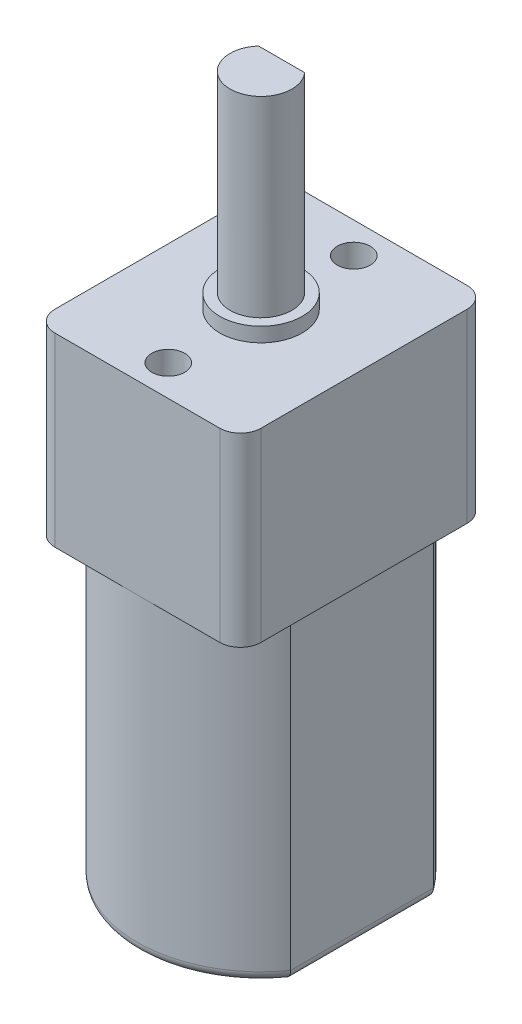
ISO-10303-21;
HEADER;
FILE_DESCRIPTION(('STEP AP214'),'2;1');
FILE_NAME('part.step','',(''),(''),'','','');
FILE_SCHEMA(('AUTOMOTIVE_DESIGN { 1 0 10303 214 1 1 1 1 }'));
ENDSEC;
DATA;
#1=APPLICATION_CONTEXT('core data for automotive mechanical design processes');
#2=APPLICATION_PROTOCOL_DEFINITION('international standard','automotive_design',2000,#1);
#3=PRODUCT_CONTEXT('',#1,'mechanical');
#4=PRODUCT('Part','Part','',(#3));
#5=PRODUCT_RELATED_PRODUCT_CATEGORY('part','',(#4));
#6=PRODUCT_DEFINITION_FORMATION('','',#4);
#7=PRODUCT_DEFINITION_CONTEXT('part definition',#1,'design');
#8=PRODUCT_DEFINITION('design','',#6,#7);
#9=PRODUCT_DEFINITION_SHAPE('','',#8);
#10=(LENGTH_UNIT() NAMED_UNIT(*) SI_UNIT(.MILLI.,.METRE.));
#11=(NAMED_UNIT(*) PLANE_ANGLE_UNIT() SI_UNIT($,.RADIAN.));
#12=(NAMED_UNIT(*) SI_UNIT($,.STERADIAN.) SOLID_ANGLE_UNIT());
#13=UNCERTAINTY_MEASURE_WITH_UNIT(LENGTH_MEASURE(1.E-05),#10,'distance_accuracy_value','');
#14=(GEOMETRIC_REPRESENTATION_CONTEXT(3) GLOBAL_UNCERTAINTY_ASSIGNED_CONTEXT((#13)) GLOBAL_UNIT_ASSIGNED_CONTEXT((#10,
#11,#12)) REPRESENTATION_CONTEXT('',''));
#15=CARTESIAN_POINT('',(0.,0.,0.));
#16=DIRECTION('',(0.,0.,1.));
#17=DIRECTION('',(1.,0.,0.));
#18=AXIS2_PLACEMENT_3D('',#15,#16,#17);
#19=CARTESIAN_POINT('',(0.,0.,0.));
#20=DIRECTION('',(0.,1.,0.));
#21=DIRECTION('',(0.,0.,1.));
#22=AXIS2_PLACEMENT_3D('',#19,#20,#21);
#23=PLANE('',#22);
#24=DIRECTION('',(0.,0.,1.));
#25=VECTOR('',#24,1.);
#26=CARTESIAN_POINT('',(5.,0.,0.));
#27=LINE('',#26,#25);
#28=CARTESIAN_POINT('',(5.,0.,-5.));
#29=VERTEX_POINT('',#28);
#30=CARTESIAN_POINT('',(5.,0.,5.));
#31=VERTEX_POINT('',#30);
#32=EDGE_CURVE('E256',#29,#31,#27,.T.);
#33=ORIENTED_EDGE('',*,*,#32,.T.);
#34=CARTESIAN_POINT('',(4.,0.,5.));
#35=DIRECTION('',(0.,1.,0.));
#36=DIRECTION('',(0.,0.,1.));
#37=AXIS2_PLACEMENT_3D('',#34,#35,#36);
#38=CIRCLE('',#37,1.);
#39=CARTESIAN_POINT('',(4.,0.,6.));
#40=VERTEX_POINT('',#39);
#41=EDGE_CURVE('E280',#31,#40,#38,.F.);
#42=ORIENTED_EDGE('',*,*,#41,.T.);
#43=DIRECTION('',(1.,0.,0.));
#44=VECTOR('',#43,1.);
#45=CARTESIAN_POINT('',(0.,0.,6.));
#46=LINE('',#45,#44);
#47=CARTESIAN_POINT('',(0.,0.,6.));
#48=VERTEX_POINT('',#47);
#49=EDGE_CURVE('E264',#48,#40,#46,.T.);
#50=ORIENTED_EDGE('',*,*,#49,.F.);
#51=CARTESIAN_POINT('',(0.,0.,0.));
#52=DIRECTION('',(0.,-1.,0.));
#53=DIRECTION('',(0.,0.,-1.));
#54=AXIS2_PLACEMENT_3D('',#51,#52,#53);
#55=CIRCLE('',#54,6.);
#56=CARTESIAN_POINT('',(4.9,0.,3.46265793863616));
#57=VERTEX_POINT('',#56);
#58=EDGE_CURVE('E195',#57,#48,#55,.T.);
#59=ORIENTED_EDGE('',*,*,#58,.F.);
#60=DIRECTION('',(0.,0.,1.));
#61=VECTOR('',#60,1.);
#62=CARTESIAN_POINT('',(4.9,0.,-3.46265793863616));
#63=LINE('',#62,#61);
#64=CARTESIAN_POINT('',(4.9,0.,-3.46265793863616));
#65=VERTEX_POINT('',#64);
#66=EDGE_CURVE('E186',#65,#57,#63,.T.);
#67=ORIENTED_EDGE('',*,*,#66,.F.);
#68=CARTESIAN_POINT('',(0.,0.,0.));
#69=DIRECTION('',(0.,-1.,0.));
#70=DIRECTION('',(0.,0.,-1.));
#71=AXIS2_PLACEMENT_3D('',#68,#69,#70);
#72=CIRCLE('',#71,6.);
#73=CARTESIAN_POINT('',(0.,0.,-6.));
#74=VERTEX_POINT('',#73);
#75=EDGE_CURVE('E194',#74,#65,#72,.T.);
#76=ORIENTED_EDGE('',*,*,#75,.F.);
#77=DIRECTION('',(1.,0.,0.));
#78=VECTOR('',#77,1.);
#79=CARTESIAN_POINT('',(0.,0.,-6.));
#80=LINE('',#79,#78);
#81=CARTESIAN_POINT('',(4.,0.,-6.));
#82=VERTEX_POINT('',#81);
#83=EDGE_CURVE('E257',#74,#82,#80,.T.);
#84=ORIENTED_EDGE('',*,*,#83,.T.);
#85=CARTESIAN_POINT('',(4.,0.,-5.));
#86=DIRECTION('',(0.,1.,0.));
#87=DIRECTION('',(0.,0.,1.));
#88=AXIS2_PLACEMENT_3D('',#85,#86,#87);
#89=CIRCLE('',#88,1.);
#90=EDGE_CURVE('E273',#82,#29,#89,.F.);
#91=ORIENTED_EDGE('',*,*,#90,.T.);
#92=EDGE_LOOP('',(#33,#42,#50,#59,#67,#76,#84,#91));
#93=FACE_BOUND('',#92,.T.);
#94=ADVANCED_FACE('F50',(#93),#23,.F.);
#95=CARTESIAN_POINT('',(-4.,0.,6.));
#96=VERTEX_POINT('',#95);
#97=EDGE_CURVE('E234',#96,#48,#46,.T.);
#98=ORIENTED_EDGE('',*,*,#97,.F.);
#99=CARTESIAN_POINT('',(-4.,0.,5.));
#100=DIRECTION('',(0.,1.,0.));
#101=DIRECTION('',(0.,0.,1.));
#102=AXIS2_PLACEMENT_3D('',#99,#100,#101);
#103=CIRCLE('',#102,1.);
#104=CARTESIAN_POINT('',(-5.,0.,5.));
#105=VERTEX_POINT('',#104);
#106=EDGE_CURVE('E295',#96,#105,#103,.F.);
#107=ORIENTED_EDGE('',*,*,#106,.T.);
#108=DIRECTION('',(0.,0.,1.));
#109=VECTOR('',#108,1.);
#110=CARTESIAN_POINT('',(-5.,0.,0.));
#111=LINE('',#110,#109);
#112=CARTESIAN_POINT('',(-5.,0.,-5.));
#113=VERTEX_POINT('',#112);
#114=EDGE_CURVE('E265',#113,#105,#111,.T.);
#115=ORIENTED_EDGE('',*,*,#114,.F.);
#116=CARTESIAN_POINT('',(-4.,0.,-5.));
#117=DIRECTION('',(0.,1.,0.));
#118=DIRECTION('',(0.,0.,1.));
#119=AXIS2_PLACEMENT_3D('',#116,#117,#118);
#120=CIRCLE('',#119,1.);
#121=CARTESIAN_POINT('',(-4.,0.,-6.));
#122=VERTEX_POINT('',#121);
#123=EDGE_CURVE('E292',#113,#122,#120,.F.);
#124=ORIENTED_EDGE('',*,*,#123,.T.);
#125=EDGE_CURVE('E190',#122,#74,#80,.T.);
#126=ORIENTED_EDGE('',*,*,#125,.T.);
#127=CARTESIAN_POINT('',(-4.9,0.,-3.46265793863616));
#128=VERTEX_POINT('',#127);
#129=EDGE_CURVE('E172',#128,#74,#72,.T.);
#130=ORIENTED_EDGE('',*,*,#129,.F.);
#131=DIRECTION('',(0.,0.,-1.));
#132=VECTOR('',#131,1.);
#133=CARTESIAN_POINT('',(-4.9,0.,3.46265793863616));
#134=LINE('',#133,#132);
#135=CARTESIAN_POINT('',(-4.9,0.,3.46265793863616));
#136=VERTEX_POINT('',#135);
#137=EDGE_CURVE('E183',#136,#128,#134,.T.);
#138=ORIENTED_EDGE('',*,*,#137,.F.);
#139=EDGE_CURVE('E198',#48,#136,#55,.T.);
#140=ORIENTED_EDGE('',*,*,#139,.F.);
#141=EDGE_LOOP('',(#98,#107,#115,#124,#126,#130,#138,#140));
#142=FACE_BOUND('',#141,.T.);
#143=ADVANCED_FACE('F185',(#142),#23,.F.);
#144=CARTESIAN_POINT('',(5.,9.,0.));
#145=DIRECTION('',(1.,0.,0.));
#146=DIRECTION('',(0.,0.,-1.));
#147=AXIS2_PLACEMENT_3D('',#144,#145,#146);
#148=PLANE('',#147);
#149=DIRECTION('',(0.,0.,1.));
#150=VECTOR('',#149,1.);
#151=CARTESIAN_POINT('',(5.,9.,0.));
#152=LINE('',#151,#150);
#153=CARTESIAN_POINT('',(5.,9.,-5.));
#154=VERTEX_POINT('',#153);
#155=CARTESIAN_POINT('',(5.,9.,5.));
#156=VERTEX_POINT('',#155);
#157=EDGE_CURVE('E239',#154,#156,#152,.T.);
#158=ORIENTED_EDGE('',*,*,#157,.T.);
#159=DIRECTION('',(0.,-1.,0.));
#160=VECTOR('',#159,1.);
#161=CARTESIAN_POINT('',(5.,0.,5.));
#162=LINE('',#161,#160);
#163=EDGE_CURVE('E275',#156,#31,#162,.T.);
#164=ORIENTED_EDGE('',*,*,#163,.T.);
#165=ORIENTED_EDGE('',*,*,#32,.F.);
#166=DIRECTION('',(0.,-1.,0.));
#167=VECTOR('',#166,1.);
#168=CARTESIAN_POINT('',(5.,9.,-5.));
#169=LINE('',#168,#167);
#170=EDGE_CURVE('E269',#29,#154,#169,.F.);
#171=ORIENTED_EDGE('',*,*,#170,.T.);
#172=EDGE_LOOP('',(#158,#164,#165,#171));
#173=FACE_BOUND('',#172,.T.);
#174=ADVANCED_FACE('F386',(#173),#148,.T.);
#175=CARTESIAN_POINT('',(0.,9.,-6.));
#176=DIRECTION('',(0.,0.,-1.));
#177=DIRECTION('',(-1.,0.,0.));
#178=AXIS2_PLACEMENT_3D('',#175,#176,#177);
#179=PLANE('',#178);
#180=ORIENTED_EDGE('',*,*,#125,.F.);
#181=DIRECTION('',(0.,-1.,0.));
#182=VECTOR('',#181,1.);
#183=CARTESIAN_POINT('',(-4.,9.,-6.));
#184=LINE('',#183,#182);
#185=CARTESIAN_POINT('',(-4.,9.,-6.));
#186=VERTEX_POINT('',#185);
#187=EDGE_CURVE('E302',#122,#186,#184,.F.);
#188=ORIENTED_EDGE('',*,*,#187,.T.);
#189=DIRECTION('',(1.,0.,0.));
#190=VECTOR('',#189,1.);
#191=CARTESIAN_POINT('',(0.,9.,-6.));
#192=LINE('',#191,#190);
#193=CARTESIAN_POINT('',(4.,9.,-6.));
#194=VERTEX_POINT('',#193);
#195=EDGE_CURVE('E243',#186,#194,#192,.T.);
#196=ORIENTED_EDGE('',*,*,#195,.T.);
#197=DIRECTION('',(0.,-1.,0.));
#198=VECTOR('',#197,1.);
#199=CARTESIAN_POINT('',(4.,9.,-6.));
#200=LINE('',#199,#198);
#201=EDGE_CURVE('E301',#194,#82,#200,.T.);
#202=ORIENTED_EDGE('',*,*,#201,.T.);
#203=ORIENTED_EDGE('',*,*,#83,.F.);
#204=EDGE_LOOP('',(#180,#188,#196,#202,#203));
#205=FACE_BOUND('',#204,.T.);
#206=ADVANCED_FACE('F396',(#205),#179,.T.);
#207=CARTESIAN_POINT('',(-5.,9.,0.));
#208=DIRECTION('',(1.,0.,0.));
#209=DIRECTION('',(0.,0.,-1.));
#210=AXIS2_PLACEMENT_3D('',#207,#208,#209);
#211=PLANE('',#210);
#212=ORIENTED_EDGE('',*,*,#114,.T.);
#213=DIRECTION('',(0.,-1.,0.));
#214=VECTOR('',#213,1.);
#215=CARTESIAN_POINT('',(-5.,9.,5.));
#216=LINE('',#215,#214);
#217=CARTESIAN_POINT('',(-5.,9.,5.));
#218=VERTEX_POINT('',#217);
#219=EDGE_CURVE('E299',#105,#218,#216,.F.);
#220=ORIENTED_EDGE('',*,*,#219,.T.);
#221=DIRECTION('',(0.,0.,1.));
#222=VECTOR('',#221,1.);
#223=CARTESIAN_POINT('',(-5.,9.,0.));
#224=LINE('',#223,#222);
#225=CARTESIAN_POINT('',(-5.,9.,-5.));
#226=VERTEX_POINT('',#225);
#227=EDGE_CURVE('E246',#226,#218,#224,.T.);
#228=ORIENTED_EDGE('',*,*,#227,.F.);
#229=DIRECTION('',(0.,-1.,0.));
#230=VECTOR('',#229,1.);
#231=CARTESIAN_POINT('',(-5.,0.,-5.));
#232=LINE('',#231,#230);
#233=EDGE_CURVE('E298',#226,#113,#232,.T.);
#234=ORIENTED_EDGE('',*,*,#233,.T.);
#235=EDGE_LOOP('',(#212,#220,#228,#234));
#236=FACE_BOUND('',#235,.T.);
#237=ADVANCED_FACE('F404',(#236),#211,.F.);
#238=CARTESIAN_POINT('',(0.,9.,-4.5));
#239=DIRECTION('',(0.,-1.,0.));
#240=DIRECTION('',(0.,0.,-1.));
#241=AXIS2_PLACEMENT_3D('',#238,#239,#240);
#242=CYLINDRICAL_SURFACE('',#241,0.8);
#243=CARTESIAN_POINT('',(0.,9.,-4.5));
#244=DIRECTION('',(0.,1.,0.));
#245=DIRECTION('',(0.,0.,1.));
#246=AXIS2_PLACEMENT_3D('',#243,#244,#245);
#247=CIRCLE('',#246,0.8);
#248=CARTESIAN_POINT('',(0.,9.,-3.7));
#249=VERTEX_POINT('',#248);
#250=EDGE_CURVE('E240',#249,#249,#247,.T.);
#251=ORIENTED_EDGE('',*,*,#250,.T.);
#252=EDGE_LOOP('',(#251));
#253=FACE_BOUND('',#252,.T.);
#254=CARTESIAN_POINT('',(0.,0.,-4.5));
#255=DIRECTION('',(0.,1.,0.));
#256=DIRECTION('',(0.,0.,1.));
#257=AXIS2_PLACEMENT_3D('',#254,#255,#256);
#258=CIRCLE('',#257,0.8);
#259=CARTESIAN_POINT('',(0.,0.,-3.7));
#260=VERTEX_POINT('',#259);
#261=EDGE_CURVE('E251',#260,#260,#258,.T.);
#262=ORIENTED_EDGE('',*,*,#261,.F.);
#263=EDGE_LOOP('',(#262));
#264=FACE_BOUND('',#263,.T.);
#265=ADVANCED_FACE('F435',(#253,#264),#242,.F.);
#266=CARTESIAN_POINT('',(0.,9.,4.5));
#267=DIRECTION('',(0.,-1.,0.));
#268=DIRECTION('',(0.,0.,-1.));
#269=AXIS2_PLACEMENT_3D('',#266,#267,#268);
#270=CYLINDRICAL_SURFACE('',#269,0.8);
#271=CARTESIAN_POINT('',(0.,9.,4.5));
#272=DIRECTION('',(0.,1.,0.));
#273=DIRECTION('',(0.,0.,1.));
#274=AXIS2_PLACEMENT_3D('',#271,#272,#273);
#275=CIRCLE('',#274,0.8);
#276=CARTESIAN_POINT('',(0.,9.,5.3));
#277=VERTEX_POINT('',#276);
#278=EDGE_CURVE('E231',#277,#277,#275,.T.);
#279=ORIENTED_EDGE('',*,*,#278,.T.);
#280=EDGE_LOOP('',(#279));
#281=FACE_BOUND('',#280,.T.);
#282=CARTESIAN_POINT('',(0.,0.,4.5));
#283=DIRECTION('',(0.,1.,0.));
#284=DIRECTION('',(0.,0.,1.));
#285=AXIS2_PLACEMENT_3D('',#282,#283,#284);
#286=CIRCLE('',#285,0.8);
#287=CARTESIAN_POINT('',(0.,0.,5.3));
#288=VERTEX_POINT('',#287);
#289=EDGE_CURVE('E230',#288,#288,#286,.T.);
#290=ORIENTED_EDGE('',*,*,#289,.F.);
#291=EDGE_LOOP('',(#290));
#292=FACE_BOUND('',#291,.T.);
#293=ADVANCED_FACE('F429',(#281,#292),#270,.F.);
#294=CARTESIAN_POINT('',(0.,9.,6.));
#295=DIRECTION('',(0.,0.,-1.));
#296=DIRECTION('',(-1.,0.,0.));
#297=AXIS2_PLACEMENT_3D('',#294,#295,#296);
#298=PLANE('',#297);
#299=ORIENTED_EDGE('',*,*,#49,.T.);
#300=DIRECTION('',(0.,-1.,0.));
#301=VECTOR('',#300,1.);
#302=CARTESIAN_POINT('',(4.,9.,6.));
#303=LINE('',#302,#301);
#304=CARTESIAN_POINT('',(4.,9.,6.));
#305=VERTEX_POINT('',#304);
#306=EDGE_CURVE('E285',#40,#305,#303,.F.);
#307=ORIENTED_EDGE('',*,*,#306,.T.);
#308=DIRECTION('',(1.,0.,0.));
#309=VECTOR('',#308,1.);
#310=CARTESIAN_POINT('',(0.,9.,6.));
#311=LINE('',#310,#309);
#312=CARTESIAN_POINT('',(-4.,9.,6.));
#313=VERTEX_POINT('',#312);
#314=EDGE_CURVE('E248',#313,#305,#311,.T.);
#315=ORIENTED_EDGE('',*,*,#314,.F.);
#316=DIRECTION('',(0.,-1.,0.));
#317=VECTOR('',#316,1.);
#318=CARTESIAN_POINT('',(-4.,9.,6.));
#319=LINE('',#318,#317);
#320=EDGE_CURVE('E276',#313,#96,#319,.T.);
#321=ORIENTED_EDGE('',*,*,#320,.T.);
#322=ORIENTED_EDGE('',*,*,#97,.T.);
#323=EDGE_LOOP('',(#299,#307,#315,#321,#322));
#324=FACE_BOUND('',#323,.T.);
#325=ADVANCED_FACE('F376',(#324),#298,.F.);
#326=CARTESIAN_POINT('',(0.,9.,0.));
#327=DIRECTION('',(0.,1.,0.));
#328=DIRECTION('',(0.,0.,1.));
#329=AXIS2_PLACEMENT_3D('',#326,#327,#328);
#330=PLANE('',#329);
#331=CARTESIAN_POINT('',(0.,9.,0.));
#332=DIRECTION('',(0.,1.,0.));
#333=DIRECTION('',(0.,0.,1.));
#334=AXIS2_PLACEMENT_3D('',#331,#332,#333);
#335=CIRCLE('',#334,2.);
#336=CARTESIAN_POINT('',(0.,9.,2.));
#337=VERTEX_POINT('',#336);
#338=EDGE_CURVE('E229',#337,#337,#335,.T.);
#339=ORIENTED_EDGE('',*,*,#338,.F.);
#340=EDGE_LOOP('',(#339));
#341=FACE_BOUND('',#340,.T.);
#342=ORIENTED_EDGE('',*,*,#278,.F.);
#343=EDGE_LOOP('',(#342));
#344=FACE_BOUND('',#343,.T.);
#345=ORIENTED_EDGE('',*,*,#250,.F.);
#346=EDGE_LOOP('',(#345));
#347=FACE_BOUND('',#346,.T.);
#348=ORIENTED_EDGE('',*,*,#314,.T.);
#349=CARTESIAN_POINT('',(4.,9.,5.));
#350=DIRECTION('',(0.,1.,0.));
#351=DIRECTION('',(0.,0.,1.));
#352=AXIS2_PLACEMENT_3D('',#349,#350,#351);
#353=CIRCLE('',#352,1.);
#354=EDGE_CURVE('E286',#305,#156,#353,.T.);
#355=ORIENTED_EDGE('',*,*,#354,.T.);
#356=ORIENTED_EDGE('',*,*,#157,.F.);
#357=CARTESIAN_POINT('',(4.,9.,-5.));
#358=DIRECTION('',(0.,1.,0.));
#359=DIRECTION('',(0.,0.,1.));
#360=AXIS2_PLACEMENT_3D('',#357,#358,#359);
#361=CIRCLE('',#360,1.);
#362=EDGE_CURVE('E284',#154,#194,#361,.T.);
#363=ORIENTED_EDGE('',*,*,#362,.T.);
#364=ORIENTED_EDGE('',*,*,#195,.F.);
#365=CARTESIAN_POINT('',(-4.,9.,-5.));
#366=DIRECTION('',(0.,1.,0.));
#367=DIRECTION('',(0.,0.,1.));
#368=AXIS2_PLACEMENT_3D('',#365,#366,#367);
#369=CIRCLE('',#368,1.);
#370=EDGE_CURVE('E287',#186,#226,#369,.T.);
#371=ORIENTED_EDGE('',*,*,#370,.T.);
#372=ORIENTED_EDGE('',*,*,#227,.T.);
#373=CARTESIAN_POINT('',(-4.,9.,5.));
#374=DIRECTION('',(0.,1.,0.));
#375=DIRECTION('',(0.,0.,1.));
#376=AXIS2_PLACEMENT_3D('',#373,#374,#375);
#377=CIRCLE('',#376,1.);
#378=EDGE_CURVE('E288',#218,#313,#377,.T.);
#379=ORIENTED_EDGE('',*,*,#378,.T.);
#380=EDGE_LOOP('',(#348,#355,#356,#363,#364,#371,#372,#379));
#381=FACE_BOUND('',#380,.T.);
#382=ADVANCED_FACE('F381',(#341,#344,#347,#381),#330,.T.);
#383=CARTESIAN_POINT('',(0.,9.7,0.));
#384=DIRECTION('',(0.,-1.,0.));
#385=DIRECTION('',(0.,0.,-1.));
#386=AXIS2_PLACEMENT_3D('',#383,#384,#385);
#387=CYLINDRICAL_SURFACE('',#386,2.);
#388=ORIENTED_EDGE('',*,*,#338,.T.);
#389=EDGE_LOOP('',(#388));
#390=FACE_BOUND('',#389,.T.);
#391=CARTESIAN_POINT('',(0.,9.7,0.));
#392=DIRECTION('',(0.,1.,0.));
#393=DIRECTION('',(0.,0.,1.));
#394=AXIS2_PLACEMENT_3D('',#391,#392,#393);
#395=CIRCLE('',#394,2.);
#396=CARTESIAN_POINT('',(0.,9.7,2.));
#397=VERTEX_POINT('',#396);
#398=EDGE_CURVE('E228',#397,#397,#395,.T.);
#399=ORIENTED_EDGE('',*,*,#398,.F.);
#400=EDGE_LOOP('',(#399));
#401=FACE_BOUND('',#400,.T.);
#402=ADVANCED_FACE('F495',(#390,#401),#387,.T.);
#403=CARTESIAN_POINT('',(0.,9.7,0.));
#404=DIRECTION('',(0.,1.,0.));
#405=DIRECTION('',(0.,0.,1.));
#406=AXIS2_PLACEMENT_3D('',#403,#404,#405);
#407=PLANE('',#406);
#408=CARTESIAN_POINT('',(0.,9.7,0.));
#409=DIRECTION('',(0.,1.,0.));
#410=DIRECTION('',(0.,0.,1.));
#411=AXIS2_PLACEMENT_3D('',#408,#409,#410);
#412=CIRCLE('',#411,1.5);
#413=CARTESIAN_POINT('',(0.,9.7,1.5));
#414=VERTEX_POINT('',#413);
#415=EDGE_CURVE('E223',#414,#414,#412,.T.);
#416=ORIENTED_EDGE('',*,*,#415,.F.);
#417=EDGE_LOOP('',(#416));
#418=FACE_BOUND('',#417,.T.);
#419=ORIENTED_EDGE('',*,*,#398,.T.);
#420=EDGE_LOOP('',(#419));
#421=FACE_BOUND('',#420,.T.);
#422=ADVANCED_FACE('F490',(#418,#421),#407,.T.);
#423=CARTESIAN_POINT('',(0.,19.,-1.));
#424=DIRECTION('',(0.,0.,-1.));
#425=DIRECTION('',(-1.,0.,0.));
#426=AXIS2_PLACEMENT_3D('',#423,#424,#425);
#427=PLANE('',#426);
#428=DIRECTION('',(1.,0.,0.));
#429=VECTOR('',#428,1.);
#430=CARTESIAN_POINT('',(0.,10.,-1.));
#431=LINE('',#430,#429);
#432=CARTESIAN_POINT('',(-1.11803398874989,10.,-1.));
#433=VERTEX_POINT('',#432);
#434=CARTESIAN_POINT('',(1.1180339887499,10.,-1.));
#435=VERTEX_POINT('',#434);
#436=EDGE_CURVE('E208',#433,#435,#431,.T.);
#437=ORIENTED_EDGE('',*,*,#436,.F.);
#438=DIRECTION('',(0.,-1.,0.));
#439=VECTOR('',#438,1.);
#440=CARTESIAN_POINT('',(-1.11803398874989,19.,-1.));
#441=LINE('',#440,#439);
#442=CARTESIAN_POINT('',(-1.11803398874989,19.,-1.));
#443=VERTEX_POINT('',#442);
#444=EDGE_CURVE('E216',#443,#433,#441,.T.);
#445=ORIENTED_EDGE('',*,*,#444,.F.);
#446=DIRECTION('',(1.,0.,0.));
#447=VECTOR('',#446,1.);
#448=CARTESIAN_POINT('',(0.,19.,-1.));
#449=LINE('',#448,#447);
#450=CARTESIAN_POINT('',(1.11803398874989,19.,-1.));
#451=VERTEX_POINT('',#450);
#452=EDGE_CURVE('E214',#443,#451,#449,.T.);
#453=ORIENTED_EDGE('',*,*,#452,.T.);
#454=DIRECTION('',(0.,-1.,0.));
#455=VECTOR('',#454,1.);
#456=CARTESIAN_POINT('',(1.11803398874989,19.,-1.));
#457=LINE('',#456,#455);
#458=EDGE_CURVE('E218',#451,#435,#457,.T.);
#459=ORIENTED_EDGE('',*,*,#458,.T.);
#460=EDGE_LOOP('',(#437,#445,#453,#459));
#461=FACE_BOUND('',#460,.T.);
#462=ADVANCED_FACE('F481',(#461),#427,.T.);
#463=CARTESIAN_POINT('',(0.,19.,0.));
#464=DIRECTION('',(0.,-1.,0.));
#465=DIRECTION('',(0.,0.,-1.));
#466=AXIS2_PLACEMENT_3D('',#463,#464,#465);
#467=CYLINDRICAL_SURFACE('',#466,1.5);
#468=ORIENTED_EDGE('',*,*,#415,.T.);
#469=EDGE_LOOP('',(#468));
#470=FACE_BOUND('',#469,.T.);
#471=ORIENTED_EDGE('',*,*,#444,.T.);
#472=CARTESIAN_POINT('',(0.,10.,0.));
#473=DIRECTION('',(0.,1.,0.));
#474=DIRECTION('',(0.,0.,1.));
#475=AXIS2_PLACEMENT_3D('',#472,#473,#474);
#476=CIRCLE('',#475,1.5);
#477=EDGE_CURVE('E210',#435,#433,#476,.T.);
#478=ORIENTED_EDGE('',*,*,#477,.F.);
#479=ORIENTED_EDGE('',*,*,#458,.F.);
#480=CARTESIAN_POINT('',(0.,19.,0.));
#481=DIRECTION('',(0.,1.,0.));
#482=DIRECTION('',(0.,0.,1.));
#483=AXIS2_PLACEMENT_3D('',#480,#481,#482);
#484=CIRCLE('',#483,1.5);
#485=EDGE_CURVE('E217',#443,#451,#484,.T.);
#486=ORIENTED_EDGE('',*,*,#485,.F.);
#487=EDGE_LOOP('',(#471,#478,#479,#486));
#488=FACE_BOUND('',#487,.T.);
#489=ADVANCED_FACE('F482',(#470,#488),#467,.T.);
#490=CARTESIAN_POINT('',(0.,19.,0.));
#491=DIRECTION('',(0.,1.,0.));
#492=DIRECTION('',(0.,0.,1.));
#493=AXIS2_PLACEMENT_3D('',#490,#491,#492);
#494=PLANE('',#493);
#495=ORIENTED_EDGE('',*,*,#452,.F.);
#496=ORIENTED_EDGE('',*,*,#485,.T.);
#497=EDGE_LOOP('',(#495,#496));
#498=FACE_BOUND('',#497,.T.);
#499=ADVANCED_FACE('F480',(#498),#494,.T.);
#500=CARTESIAN_POINT('',(0.,10.,0.));
#501=DIRECTION('',(0.,1.,0.));
#502=DIRECTION('',(0.,0.,1.));
#503=AXIS2_PLACEMENT_3D('',#500,#501,#502);
#504=PLANE('',#503);
#505=ORIENTED_EDGE('',*,*,#477,.T.);
#506=ORIENTED_EDGE('',*,*,#436,.T.);
#507=EDGE_LOOP('',(#505,#506));
#508=FACE_BOUND('',#507,.T.);
#509=ADVANCED_FACE('F471',(#508),#504,.T.);
#510=CARTESIAN_POINT('',(0.,-15.1,0.));
#511=DIRECTION('',(0.,-1.,0.));
#512=DIRECTION('',(0.,0.,-1.));
#513=AXIS2_PLACEMENT_3D('',#510,#511,#512);
#514=PLANE('',#513);
#515=CARTESIAN_POINT('',(0.,-15.1,0.));
#516=DIRECTION('',(0.,-1.,0.));
#517=DIRECTION('',(0.,0.,-1.));
#518=AXIS2_PLACEMENT_3D('',#515,#516,#517);
#519=CIRCLE('',#518,5.5);
#520=CARTESIAN_POINT('',(-4.4,-15.1,-3.30000000000013));
#521=VERTEX_POINT('',#520);
#522=CARTESIAN_POINT('',(4.39999999999991,-15.1,-3.30000000000012));
#523=VERTEX_POINT('',#522);
#524=EDGE_CURVE('E309',#521,#523,#519,.T.);
#525=ORIENTED_EDGE('',*,*,#524,.T.);
#526=DIRECTION('',(0.,0.,1.));
#527=VECTOR('',#526,1.);
#528=CARTESIAN_POINT('',(4.4,-15.1,3.46265793863616));
#529=LINE('',#528,#527);
#530=CARTESIAN_POINT('',(4.39999999999991,-15.1,3.30000000000013));
#531=VERTEX_POINT('',#530);
#532=EDGE_CURVE('E315',#523,#531,#529,.T.);
#533=ORIENTED_EDGE('',*,*,#532,.T.);
#534=CARTESIAN_POINT('',(0.,-15.1,0.));
#535=DIRECTION('',(0.,-1.,0.));
#536=DIRECTION('',(0.,0.,-1.));
#537=AXIS2_PLACEMENT_3D('',#534,#535,#536);
#538=CIRCLE('',#537,5.5);
#539=CARTESIAN_POINT('',(-4.39999999999991,-15.1,3.30000000000013));
#540=VERTEX_POINT('',#539);
#541=EDGE_CURVE('E306',#531,#540,#538,.T.);
#542=ORIENTED_EDGE('',*,*,#541,.T.);
#543=DIRECTION('',(0.,0.,-1.));
#544=VECTOR('',#543,1.);
#545=CARTESIAN_POINT('',(-4.4,-15.1,-3.46265793863616));
#546=LINE('',#545,#544);
#547=EDGE_CURVE('E308',#540,#521,#546,.T.);
#548=ORIENTED_EDGE('',*,*,#547,.T.);
#549=EDGE_LOOP('',(#525,#533,#542,#548));
#550=FACE_BOUND('',#549,.T.);
#551=CARTESIAN_POINT('',(0.,-15.1,0.));
#552=DIRECTION('',(0.,-1.,0.));
#553=DIRECTION('',(0.,0.,-1.));
#554=AXIS2_PLACEMENT_3D('',#551,#552,#553);
#555=CIRCLE('',#554,2.5);
#556=CARTESIAN_POINT('',(0.,-15.1,-2.5));
#557=VERTEX_POINT('',#556);
#558=EDGE_CURVE('E773',#557,#557,#555,.T.);
#559=ORIENTED_EDGE('',*,*,#558,.F.);
#560=EDGE_LOOP('',(#559));
#561=FACE_BOUND('',#560,.T.);
#562=ADVANCED_FACE('F463',(#550,#561),#514,.T.);
#563=CARTESIAN_POINT('',(4.9,-15.1,-3.46265793863616));
#564=DIRECTION('',(-1.,0.,0.));
#565=DIRECTION('',(0.,0.,1.));
#566=AXIS2_PLACEMENT_3D('',#563,#564,#565);
#567=PLANE('',#566);
#568=DIRECTION('',(0.,1.,0.));
#569=VECTOR('',#568,1.);
#570=CARTESIAN_POINT('',(4.9,-15.1,3.46265793863616));
#571=LINE('',#570,#569);
#572=CARTESIAN_POINT('',(4.9,-14.6,3.46265793863616));
#573=VERTEX_POINT('',#572);
#574=EDGE_CURVE('E202',#573,#57,#571,.T.);
#575=ORIENTED_EDGE('',*,*,#574,.F.);
#576=DIRECTION('',(0.,0.,1.));
#577=VECTOR('',#576,1.);
#578=CARTESIAN_POINT('',(4.9,-14.6,-3.46265793863616));
#579=LINE('',#578,#577);
#580=CARTESIAN_POINT('',(4.9,-14.6,-3.46265793863616));
#581=VERTEX_POINT('',#580);
#582=EDGE_CURVE('E314',#573,#581,#579,.F.);
#583=ORIENTED_EDGE('',*,*,#582,.T.);
#584=DIRECTION('',(0.,1.,0.));
#585=VECTOR('',#584,1.);
#586=CARTESIAN_POINT('',(4.9,-15.1,-3.46265793863616));
#587=LINE('',#586,#585);
#588=EDGE_CURVE('E180',#581,#65,#587,.T.);
#589=ORIENTED_EDGE('',*,*,#588,.T.);
#590=ORIENTED_EDGE('',*,*,#66,.T.);
#591=EDGE_LOOP('',(#575,#583,#589,#590));
#592=FACE_BOUND('',#591,.T.);
#593=ADVANCED_FACE('F364',(#592),#567,.F.);
#594=CARTESIAN_POINT('',(0.,-15.1,0.));
#595=DIRECTION('',(0.,1.,0.));
#596=DIRECTION('',(0.,0.,1.));
#597=AXIS2_PLACEMENT_3D('',#594,#595,#596);
#598=CYLINDRICAL_SURFACE('',#597,6.);
#599=ORIENTED_EDGE('',*,*,#588,.F.);
#600=CARTESIAN_POINT('',(0.,-14.6,0.));
#601=DIRECTION('',(0.,-1.,0.));
#602=DIRECTION('',(0.,0.,-1.));
#603=AXIS2_PLACEMENT_3D('',#600,#601,#602);
#604=CIRCLE('',#603,6.);
#605=CARTESIAN_POINT('',(-4.9,-14.6,-3.46265793863616));
#606=VERTEX_POINT('',#605);
#607=EDGE_CURVE('E77',#581,#606,#604,.F.);
#608=ORIENTED_EDGE('',*,*,#607,.T.);
#609=DIRECTION('',(0.,1.,0.));
#610=VECTOR('',#609,1.);
#611=CARTESIAN_POINT('',(-4.9,-15.1,-3.46265793863616));
#612=LINE('',#611,#610);
#613=EDGE_CURVE('E167',#606,#128,#612,.T.);
#614=ORIENTED_EDGE('',*,*,#613,.T.);
#615=ORIENTED_EDGE('',*,*,#129,.T.);
#616=ORIENTED_EDGE('',*,*,#75,.T.);
#617=EDGE_LOOP('',(#599,#608,#614,#615,#616));
#618=FACE_BOUND('',#617,.T.);
#619=ADVANCED_FACE('F175',(#618),#598,.T.);
#620=CARTESIAN_POINT('',(-4.9,-15.1,3.46265793863616));
#621=DIRECTION('',(1.,0.,0.));
#622=DIRECTION('',(0.,0.,-1.));
#623=AXIS2_PLACEMENT_3D('',#620,#621,#622);
#624=PLANE('',#623);
#625=ORIENTED_EDGE('',*,*,#613,.F.);
#626=DIRECTION('',(0.,0.,-1.));
#627=VECTOR('',#626,1.);
#628=CARTESIAN_POINT('',(-4.9,-14.6,3.46265793863616));
#629=LINE('',#628,#627);
#630=CARTESIAN_POINT('',(-4.9,-14.6,3.46265793863616));
#631=VERTEX_POINT('',#630);
#632=EDGE_CURVE('E64',#606,#631,#629,.F.);
#633=ORIENTED_EDGE('',*,*,#632,.T.);
#634=DIRECTION('',(0.,1.,0.));
#635=VECTOR('',#634,1.);
#636=CARTESIAN_POINT('',(-4.9,-15.1,3.46265793863616));
#637=LINE('',#636,#635);
#638=EDGE_CURVE('E176',#631,#136,#637,.T.);
#639=ORIENTED_EDGE('',*,*,#638,.T.);
#640=ORIENTED_EDGE('',*,*,#137,.T.);
#641=EDGE_LOOP('',(#625,#633,#639,#640));
#642=FACE_BOUND('',#641,.T.);
#643=ADVANCED_FACE('F191',(#642),#624,.F.);
#644=CARTESIAN_POINT('',(0.,-15.1,0.));
#645=DIRECTION('',(0.,1.,0.));
#646=DIRECTION('',(0.,0.,1.));
#647=AXIS2_PLACEMENT_3D('',#644,#645,#646);
#648=CYLINDRICAL_SURFACE('',#647,6.);
#649=ORIENTED_EDGE('',*,*,#638,.F.);
#650=CARTESIAN_POINT('',(0.,-14.6,0.));
#651=DIRECTION('',(0.,-1.,0.));
#652=DIRECTION('',(0.,0.,-1.));
#653=AXIS2_PLACEMENT_3D('',#650,#651,#652);
#654=CIRCLE('',#653,6.);
#655=EDGE_CURVE('E12',#631,#573,#654,.F.);
#656=ORIENTED_EDGE('',*,*,#655,.T.);
#657=ORIENTED_EDGE('',*,*,#574,.T.);
#658=ORIENTED_EDGE('',*,*,#58,.T.);
#659=ORIENTED_EDGE('',*,*,#139,.T.);
#660=EDGE_LOOP('',(#649,#656,#657,#658,#659));
#661=FACE_BOUND('',#660,.T.);
#662=ADVANCED_FACE('F369',(#661),#648,.T.);
#663=CARTESIAN_POINT('',(0.,0.,0.));
#664=DIRECTION('',(0.,-1.,0.));
#665=DIRECTION('',(0.,0.,-1.));
#666=AXIS2_PLACEMENT_3D('',#663,#664,#665);
#667=PLANE('',#666);
#668=ORIENTED_EDGE('',*,*,#261,.T.);
#669=EDGE_LOOP('',(#668));
#670=FACE_BOUND('',#669,.T.);
#671=ADVANCED_FACE('F454',(#670),#667,.F.);
#672=ORIENTED_EDGE('',*,*,#289,.T.);
#673=EDGE_LOOP('',(#672));
#674=FACE_BOUND('',#673,.T.);
#675=ADVANCED_FACE('F449',(#674),#667,.F.);
#676=CARTESIAN_POINT('',(0.,-16.3,0.));
#677=DIRECTION('',(0.,-1.,0.));
#678=DIRECTION('',(0.,0.,-1.));
#679=AXIS2_PLACEMENT_3D('',#676,#677,#678);
#680=PLANE('',#679);
#681=CARTESIAN_POINT('',(0.,-16.3,0.));
#682=DIRECTION('',(0.,-1.,0.));
#683=DIRECTION('',(0.,0.,-1.));
#684=AXIS2_PLACEMENT_3D('',#681,#682,#683);
#685=CIRCLE('',#684,2.5);
#686=CARTESIAN_POINT('',(0.,-16.3,-2.5));
#687=VERTEX_POINT('',#686);
#688=EDGE_CURVE('E196',#687,#687,#685,.T.);
#689=ORIENTED_EDGE('',*,*,#688,.T.);
#690=EDGE_LOOP('',(#689));
#691=FACE_BOUND('',#690,.T.);
#692=CARTESIAN_POINT('',(0.,-16.3,0.));
#693=DIRECTION('',(0.,-1.,0.));
#694=DIRECTION('',(0.,0.,-1.));
#695=AXIS2_PLACEMENT_3D('',#692,#693,#694);
#696=CIRCLE('',#695,0.75);
#697=CARTESIAN_POINT('',(0.,-16.3,-0.75));
#698=VERTEX_POINT('',#697);
#699=EDGE_CURVE('E353',#698,#698,#696,.T.);
#700=ORIENTED_EDGE('',*,*,#699,.F.);
#701=EDGE_LOOP('',(#700));
#702=FACE_BOUND('',#701,.T.);
#703=ADVANCED_FACE('F448',(#691,#702),#680,.T.);
#704=CARTESIAN_POINT('',(0.,-16.3,0.));
#705=DIRECTION('',(0.,1.,0.));
#706=DIRECTION('',(0.,0.,1.));
#707=AXIS2_PLACEMENT_3D('',#704,#705,#706);
#708=CYLINDRICAL_SURFACE('',#707,2.5);
#709=ORIENTED_EDGE('',*,*,#688,.F.);
#710=EDGE_LOOP('',(#709));
#711=FACE_BOUND('',#710,.T.);
#712=ORIENTED_EDGE('',*,*,#558,.T.);
#713=EDGE_LOOP('',(#712));
#714=FACE_BOUND('',#713,.T.);
#715=ADVANCED_FACE('F458',(#711,#714),#708,.T.);
#716=CARTESIAN_POINT('',(0.,-16.3,0.));
#717=DIRECTION('',(0.,1.,0.));
#718=DIRECTION('',(0.,0.,1.));
#719=AXIS2_PLACEMENT_3D('',#716,#717,#718);
#720=CYLINDRICAL_SURFACE('',#719,0.75);
#721=ORIENTED_EDGE('',*,*,#699,.T.);
#722=EDGE_LOOP('',(#721));
#723=FACE_BOUND('',#722,.T.);
#724=CARTESIAN_POINT('',(0.,-15.1,0.));
#725=DIRECTION('',(0.,-1.,0.));
#726=DIRECTION('',(0.,0.,-1.));
#727=AXIS2_PLACEMENT_3D('',#724,#725,#726);
#728=CIRCLE('',#727,0.75);
#729=CARTESIAN_POINT('',(0.,-15.1,-0.75));
#730=VERTEX_POINT('',#729);
#731=EDGE_CURVE('E270',#730,#730,#728,.F.);
#732=ORIENTED_EDGE('',*,*,#731,.T.);
#733=EDGE_LOOP('',(#732));
#734=FACE_BOUND('',#733,.T.);
#735=ADVANCED_FACE('F552',(#723,#734),#720,.F.);
#736=ORIENTED_EDGE('',*,*,#731,.F.);
#737=EDGE_LOOP('',(#736));
#738=FACE_BOUND('',#737,.T.);
#739=ADVANCED_FACE('F420',(#738),#514,.T.);
#740=CARTESIAN_POINT('',(4.,9.,5.));
#741=DIRECTION('',(0.,1.,0.));
#742=DIRECTION('',(0.,0.,1.));
#743=AXIS2_PLACEMENT_3D('',#740,#741,#742);
#744=CYLINDRICAL_SURFACE('',#743,1.);
#745=ORIENTED_EDGE('',*,*,#354,.F.);
#746=ORIENTED_EDGE('',*,*,#306,.F.);
#747=ORIENTED_EDGE('',*,*,#41,.F.);
#748=ORIENTED_EDGE('',*,*,#163,.F.);
#749=EDGE_LOOP('',(#745,#746,#747,#748));
#750=FACE_BOUND('',#749,.T.);
#751=ADVANCED_FACE('F379',(#750),#744,.T.);
#752=CARTESIAN_POINT('',(-4.,9.,5.));
#753=DIRECTION('',(0.,-1.,0.));
#754=DIRECTION('',(0.,0.,-1.));
#755=AXIS2_PLACEMENT_3D('',#752,#753,#754);
#756=CYLINDRICAL_SURFACE('',#755,1.);
#757=ORIENTED_EDGE('',*,*,#378,.F.);
#758=ORIENTED_EDGE('',*,*,#219,.F.);
#759=ORIENTED_EDGE('',*,*,#106,.F.);
#760=ORIENTED_EDGE('',*,*,#320,.F.);
#761=EDGE_LOOP('',(#757,#758,#759,#760));
#762=FACE_BOUND('',#761,.T.);
#763=ADVANCED_FACE('F409',(#762),#756,.T.);
#764=CARTESIAN_POINT('',(-4.,9.,-5.));
#765=DIRECTION('',(0.,1.,0.));
#766=DIRECTION('',(0.,0.,1.));
#767=AXIS2_PLACEMENT_3D('',#764,#765,#766);
#768=CYLINDRICAL_SURFACE('',#767,1.);
#769=ORIENTED_EDGE('',*,*,#370,.F.);
#770=ORIENTED_EDGE('',*,*,#187,.F.);
#771=ORIENTED_EDGE('',*,*,#123,.F.);
#772=ORIENTED_EDGE('',*,*,#233,.F.);
#773=EDGE_LOOP('',(#769,#770,#771,#772));
#774=FACE_BOUND('',#773,.T.);
#775=ADVANCED_FACE('F398',(#774),#768,.T.);
#776=CARTESIAN_POINT('',(4.,9.,-5.));
#777=DIRECTION('',(0.,-1.,0.));
#778=DIRECTION('',(0.,0.,-1.));
#779=AXIS2_PLACEMENT_3D('',#776,#777,#778);
#780=CYLINDRICAL_SURFACE('',#779,1.);
#781=ORIENTED_EDGE('',*,*,#362,.F.);
#782=ORIENTED_EDGE('',*,*,#170,.F.);
#783=ORIENTED_EDGE('',*,*,#90,.F.);
#784=ORIENTED_EDGE('',*,*,#201,.F.);
#785=EDGE_LOOP('',(#781,#782,#783,#784));
#786=FACE_BOUND('',#785,.T.);
#787=ADVANCED_FACE('F391',(#786),#780,.T.);
#788=CARTESIAN_POINT('',(-4.4,-14.6,0.));
#789=DIRECTION('',(0.,0.,1.));
#790=DIRECTION('',(1.,0.,0.));
#791=AXIS2_PLACEMENT_3D('',#788,#789,#790);
#792=CYLINDRICAL_SURFACE('',#791,0.5);
#793=CARTESIAN_POINT('',(-4.9,-14.6,3.46265793863616));
#794=CARTESIAN_POINT('',(-4.90002790796433,-14.6271646486715,3.46266596009818));
#795=CARTESIAN_POINT('',(-4.89778810729347,-14.654314744701,3.46195526529132));
#796=CARTESIAN_POINT('',(-4.88898729814349,-14.7077788479276,3.45915821384171));
#797=CARTESIAN_POINT('',(-4.88243492931613,-14.7340944167322,3.45707460763338));
#798=CARTESIAN_POINT('',(-4.86522136412207,-14.7851978469563,3.45159296948276));
#799=CARTESIAN_POINT('',(-4.85456003180436,-14.8099856577963,3.44819489404934));
#800=CARTESIAN_POINT('',(-4.82950346794557,-14.8573811450053,3.44019239188362));
#801=CARTESIAN_POINT('',(-4.8151077395094,-14.8799885306994,3.43558780461322));
#802=CARTESIAN_POINT('',(-4.78273383708295,-14.922878858411,3.42520682448751));
#803=CARTESIAN_POINT('',(-4.76469190175149,-14.9431085362223,3.41940953672514));
#804=CARTESIAN_POINT('',(-4.72576184932332,-14.9802680032393,3.40686298235192));
#805=CARTESIAN_POINT('',(-4.70487277225167,-14.9971966747404,3.4001133946256));
#806=CARTESIAN_POINT('',(-4.65986054057437,-15.0280776551789,3.38552044995711));
#807=CARTESIAN_POINT('',(-4.6356345915944,-15.0418631963069,3.37764169880686));
#808=CARTESIAN_POINT('',(-4.58541513772364,-15.0651743583147,3.36124684523122));
#809=CARTESIAN_POINT('',(-4.55942175182009,-15.0747002656348,3.35273078570676));
#810=CARTESIAN_POINT('',(-4.51208766476826,-15.0877534588197,3.33716045818218));
#811=CARTESIAN_POINT('',(-4.49094892902983,-15.0921303312248,3.33018581220969));
#812=CARTESIAN_POINT('',(-4.44836080122492,-15.0981185280305,3.31608854367886));
#813=CARTESIAN_POINT('',(-4.42691205063971,-15.0997349142303,3.30896621625364));
#814=CARTESIAN_POINT('',(-4.40365144371956,-15.0999900232304,3.30121698065619));
#815=CARTESIAN_POINT('',(-4.40182561257587,-15.1000000253901,3.30060853879027));
#816=CARTESIAN_POINT('',(-4.4,-15.1,3.3));
#817=B_SPLINE_CURVE_WITH_KNOTS('',3,(#793,#794,#795,#796,#797,#798,#799,#800,#801,#802,#803,
#804,#805,#806,#807,#808,#809,#810,#811,#812,#813,#814,#815,#816),.UNSPECIFIED.,.F.,.F.,(4,2,2,
2,2,2,2,2,2,2,2,4),(0.,0.0813702466723266,0.162577973145412,0.243788386724572,0.325009611629191,
0.407797934088256,0.490614239779456,0.577130578445755,0.663641098422062,0.731541938218145,
0.799318136594537,0.805091717261352),.UNSPECIFIED.);
#818=EDGE_CURVE('E344',#631,#540,#817,.T.);
#819=ORIENTED_EDGE('',*,*,#818,.F.);
#820=ORIENTED_EDGE('',*,*,#632,.F.);
#821=CARTESIAN_POINT('',(-4.9,-14.6,-3.46265793863616));
#822=CARTESIAN_POINT('',(-4.90002790796433,-14.6271646486715,-3.46266596009818));
#823=CARTESIAN_POINT('',(-4.89778810729347,-14.654314744701,-3.46195526529132));
#824=CARTESIAN_POINT('',(-4.88898729814349,-14.7077788479276,-3.45915821384171));
#825=CARTESIAN_POINT('',(-4.88243492931613,-14.7340944167322,-3.45707460763338));
#826=CARTESIAN_POINT('',(-4.86522136412207,-14.7851978469563,-3.45159296948276));
#827=CARTESIAN_POINT('',(-4.85456003180436,-14.8099856577963,-3.44819489404934));
#828=CARTESIAN_POINT('',(-4.82950346794557,-14.8573811450053,-3.44019239188362));
#829=CARTESIAN_POINT('',(-4.8151077395094,-14.8799885306994,-3.43558780461322));
#830=CARTESIAN_POINT('',(-4.78273383708295,-14.922878858411,-3.42520682448751));
#831=CARTESIAN_POINT('',(-4.76469190175149,-14.9431085362223,-3.41940953672514));
#832=CARTESIAN_POINT('',(-4.72576184932332,-14.9802680032393,-3.40686298235192));
#833=CARTESIAN_POINT('',(-4.70487277225167,-14.9971966747404,-3.4001133946256));
#834=CARTESIAN_POINT('',(-4.65986054057437,-15.0280776551789,-3.38552044995711));
#835=CARTESIAN_POINT('',(-4.6356345915944,-15.0418631963069,-3.37764169880686));
#836=CARTESIAN_POINT('',(-4.58541513772364,-15.0651743583147,-3.36124684523122));
#837=CARTESIAN_POINT('',(-4.55942175182009,-15.0747002656348,-3.35273078570676));
#838=CARTESIAN_POINT('',(-4.51208766476826,-15.0877534588197,-3.33716045818218));
#839=CARTESIAN_POINT('',(-4.49094892902983,-15.0921303312248,-3.33018581220969));
#840=CARTESIAN_POINT('',(-4.44836080122492,-15.0981185280305,-3.31608854367886));
#841=CARTESIAN_POINT('',(-4.42691205063972,-15.0997349142303,-3.30896621625364));
#842=CARTESIAN_POINT('',(-4.40365144371957,-15.0999900232304,-3.30121698065619));
#843=CARTESIAN_POINT('',(-4.40182561257587,-15.1000000253901,-3.30060853879027));
#844=CARTESIAN_POINT('',(-4.4,-15.1,-3.3));
#845=B_SPLINE_CURVE_WITH_KNOTS('',3,(#821,#822,#823,#824,#825,#826,#827,#828,#829,#830,#831,
#832,#833,#834,#835,#836,#837,#838,#839,#840,#841,#842,#843,#844),.UNSPECIFIED.,.F.,.F.,(4,2,2,
2,2,2,2,2,2,2,2,4),(0.,0.0813702466723266,0.162577973145412,0.243788386724572,0.325009611629191,
0.407797934088256,0.490614239779456,0.577130578445754,0.663641098422062,0.731541938218146,
0.799318136594536,0.805091717261352),.UNSPECIFIED.);
#846=EDGE_CURVE('E55',#521,#606,#845,.F.);
#847=ORIENTED_EDGE('',*,*,#846,.F.);
#848=ORIENTED_EDGE('',*,*,#547,.F.);
#849=EDGE_LOOP('',(#819,#820,#847,#848));
#850=FACE_BOUND('',#849,.T.);
#851=ADVANCED_FACE('F47',(#850),#792,.T.);
#852=CARTESIAN_POINT('',(0.,-14.6,0.));
#853=DIRECTION('',(0.,-1.,0.));
#854=DIRECTION('',(0.,0.,-1.));
#855=AXIS2_PLACEMENT_3D('',#852,#853,#854);
#856=TOROIDAL_SURFACE('',#855,5.5,0.5);
#857=ORIENTED_EDGE('',*,*,#846,.T.);
#858=ORIENTED_EDGE('',*,*,#607,.F.);
#859=CARTESIAN_POINT('',(4.9,-14.6,-3.46265793863616));
#860=CARTESIAN_POINT('',(4.90002790796432,-14.6271646486715,-3.46266596009818));
#861=CARTESIAN_POINT('',(4.89778810729347,-14.654314744701,-3.46195526529132));
#862=CARTESIAN_POINT('',(4.88898729814349,-14.7077788479276,-3.45915821384171));
#863=CARTESIAN_POINT('',(4.88243492931613,-14.7340944167322,-3.45707460763338));
#864=CARTESIAN_POINT('',(4.86522136412207,-14.7851978469563,-3.45159296948276));
#865=CARTESIAN_POINT('',(4.85456003180436,-14.8099856577963,-3.44819489404934));
#866=CARTESIAN_POINT('',(4.82950346794557,-14.8573811450053,-3.44019239188362));
#867=CARTESIAN_POINT('',(4.8151077395094,-14.8799885306994,-3.43558780461322));
#868=CARTESIAN_POINT('',(4.78273383708295,-14.922878858411,-3.42520682448751));
#869=CARTESIAN_POINT('',(4.76469190175149,-14.9431085362223,-3.41940953672514));
#870=CARTESIAN_POINT('',(4.72576184932332,-14.9802680032393,-3.40686298235192));
#871=CARTESIAN_POINT('',(4.70487277225167,-14.9971966747404,-3.4001133946256));
#872=CARTESIAN_POINT('',(4.65986054057437,-15.0280776551789,-3.38552044995711));
#873=CARTESIAN_POINT('',(4.6356345915944,-15.0418631963069,-3.37764169880686));
#874=CARTESIAN_POINT('',(4.58541513772364,-15.0651743583147,-3.36124684523122));
#875=CARTESIAN_POINT('',(4.55942175182009,-15.0747002656348,-3.35273078570676));
#876=CARTESIAN_POINT('',(4.51208766476826,-15.0877534588197,-3.33716045818218));
#877=CARTESIAN_POINT('',(4.49094892902983,-15.0921303312248,-3.3301858122097));
#878=CARTESIAN_POINT('',(4.44836080122492,-15.0981185280305,-3.31608854367886));
#879=CARTESIAN_POINT('',(4.42691205063972,-15.0997349142303,-3.30896621625363));
#880=CARTESIAN_POINT('',(4.40365144371957,-15.0999900232304,-3.30121698065619));
#881=CARTESIAN_POINT('',(4.40182561257587,-15.1000000253901,-3.30060853879027));
#882=CARTESIAN_POINT('',(4.4,-15.1,-3.3));
#883=B_SPLINE_CURVE_WITH_KNOTS('',3,(#859,#860,#861,#862,#863,#864,#865,#866,#867,#868,#869,
#870,#871,#872,#873,#874,#875,#876,#877,#878,#879,#880,#881,#882),.UNSPECIFIED.,.F.,.F.,(4,2,2,
2,2,2,2,2,2,2,2,4),(0.,0.0813702466723249,0.162577973145412,0.243788386724572,0.325009611629191,
0.407797934088258,0.490614239779456,0.577130578445755,0.663641098422063,0.731541938218146,
0.799318136594537,0.805091717261352),.UNSPECIFIED.);
#884=EDGE_CURVE('E328',#523,#581,#883,.F.);
#885=ORIENTED_EDGE('',*,*,#884,.F.);
#886=ORIENTED_EDGE('',*,*,#524,.F.);
#887=EDGE_LOOP('',(#857,#858,#885,#886));
#888=FACE_BOUND('',#887,.T.);
#889=ADVANCED_FACE('F339',(#888),#856,.T.);
#890=CARTESIAN_POINT('',(0.,-14.6,0.));
#891=DIRECTION('',(0.,-1.,0.));
#892=DIRECTION('',(0.,0.,-1.));
#893=AXIS2_PLACEMENT_3D('',#890,#891,#892);
#894=TOROIDAL_SURFACE('',#893,5.5,0.5);
#895=ORIENTED_EDGE('',*,*,#818,.T.);
#896=ORIENTED_EDGE('',*,*,#541,.F.);
#897=CARTESIAN_POINT('',(4.9,-14.6,3.46265793863616));
#898=CARTESIAN_POINT('',(4.90002790796433,-14.6271646486715,3.46266596009818));
#899=CARTESIAN_POINT('',(4.89778810729347,-14.654314744701,3.46195526529132));
#900=CARTESIAN_POINT('',(4.88898729814349,-14.7077788479276,3.45915821384171));
#901=CARTESIAN_POINT('',(4.88243492931613,-14.7340944167322,3.45707460763338));
#902=CARTESIAN_POINT('',(4.86522136412207,-14.7851978469563,3.45159296948276));
#903=CARTESIAN_POINT('',(4.85456003180436,-14.8099856577963,3.44819489404934));
#904=CARTESIAN_POINT('',(4.82950346794557,-14.8573811450053,3.44019239188362));
#905=CARTESIAN_POINT('',(4.8151077395094,-14.8799885306994,3.43558780461322));
#906=CARTESIAN_POINT('',(4.78273383708295,-14.922878858411,3.42520682448751));
#907=CARTESIAN_POINT('',(4.76469190175149,-14.9431085362223,3.41940953672514));
#908=CARTESIAN_POINT('',(4.72576184932332,-14.9802680032393,3.40686298235192));
#909=CARTESIAN_POINT('',(4.70487277225167,-14.9971966747404,3.4001133946256));
#910=CARTESIAN_POINT('',(4.65986054057437,-15.0280776551789,3.38552044995711));
#911=CARTESIAN_POINT('',(4.6356345915944,-15.0418631963069,3.37764169880686));
#912=CARTESIAN_POINT('',(4.58541513772364,-15.0651743583147,3.36124684523122));
#913=CARTESIAN_POINT('',(4.55942175182009,-15.0747002656348,3.35273078570676));
#914=CARTESIAN_POINT('',(4.51208766476826,-15.0877534588197,3.33716045818218));
#915=CARTESIAN_POINT('',(4.49094892902983,-15.0921303312248,3.33018581220969));
#916=CARTESIAN_POINT('',(4.44836080122492,-15.0981185280305,3.31608854367886));
#917=CARTESIAN_POINT('',(4.42691205063971,-15.0997349142303,3.30896621625364));
#918=CARTESIAN_POINT('',(4.40365144371956,-15.0999900232304,3.30121698065619));
#919=CARTESIAN_POINT('',(4.40182561257587,-15.1000000253901,3.30060853879027));
#920=CARTESIAN_POINT('',(4.4,-15.1,3.3));
#921=B_SPLINE_CURVE_WITH_KNOTS('',3,(#897,#898,#899,#900,#901,#902,#903,#904,#905,#906,#907,
#908,#909,#910,#911,#912,#913,#914,#915,#916,#917,#918,#919,#920),.UNSPECIFIED.,.F.,.F.,(4,2,2,
2,2,2,2,2,2,2,2,4),(0.,0.0813702466723266,0.162577973145412,0.243788386724572,0.325009611629191,
0.407797934088256,0.490614239779456,0.577130578445755,0.663641098422062,0.731541938218145,
0.799318136594537,0.805091717261352),.UNSPECIFIED.);
#922=EDGE_CURVE('E318',#573,#531,#921,.T.);
#923=ORIENTED_EDGE('',*,*,#922,.F.);
#924=ORIENTED_EDGE('',*,*,#655,.F.);
#925=EDGE_LOOP('',(#895,#896,#923,#924));
#926=FACE_BOUND('',#925,.T.);
#927=ADVANCED_FACE('F337',(#926),#894,.T.);
#928=CARTESIAN_POINT('',(4.4,-14.6,0.));
#929=DIRECTION('',(0.,0.,-1.));
#930=DIRECTION('',(-1.,0.,0.));
#931=AXIS2_PLACEMENT_3D('',#928,#929,#930);
#932=CYLINDRICAL_SURFACE('',#931,0.5);
#933=ORIENTED_EDGE('',*,*,#884,.T.);
#934=ORIENTED_EDGE('',*,*,#582,.F.);
#935=ORIENTED_EDGE('',*,*,#922,.T.);
#936=ORIENTED_EDGE('',*,*,#532,.F.);
#937=EDGE_LOOP('',(#933,#934,#935,#936));
#938=FACE_BOUND('',#937,.T.);
#939=ADVANCED_FACE('F332',(#938),#932,.T.);
#940=CLOSED_SHELL('',(#94,#143,#174,#206,#237,#265,#293,#325,#382,#402,#422,#462,#489,#499,#509,
#562,#593,#619,#643,#662,#671,#675,#703,#715,#735,#739,#751,#763,#775,#787,#851,#889,#927,#939));
#941=MANIFOLD_SOLID_BREP('B2',#940);
#942=ADVANCED_BREP_SHAPE_REPRESENTATION('',(#18,#941),#14);
#943=SHAPE_DEFINITION_REPRESENTATION(#9,#942);
ENDSEC;
END-ISO-10303-21;
